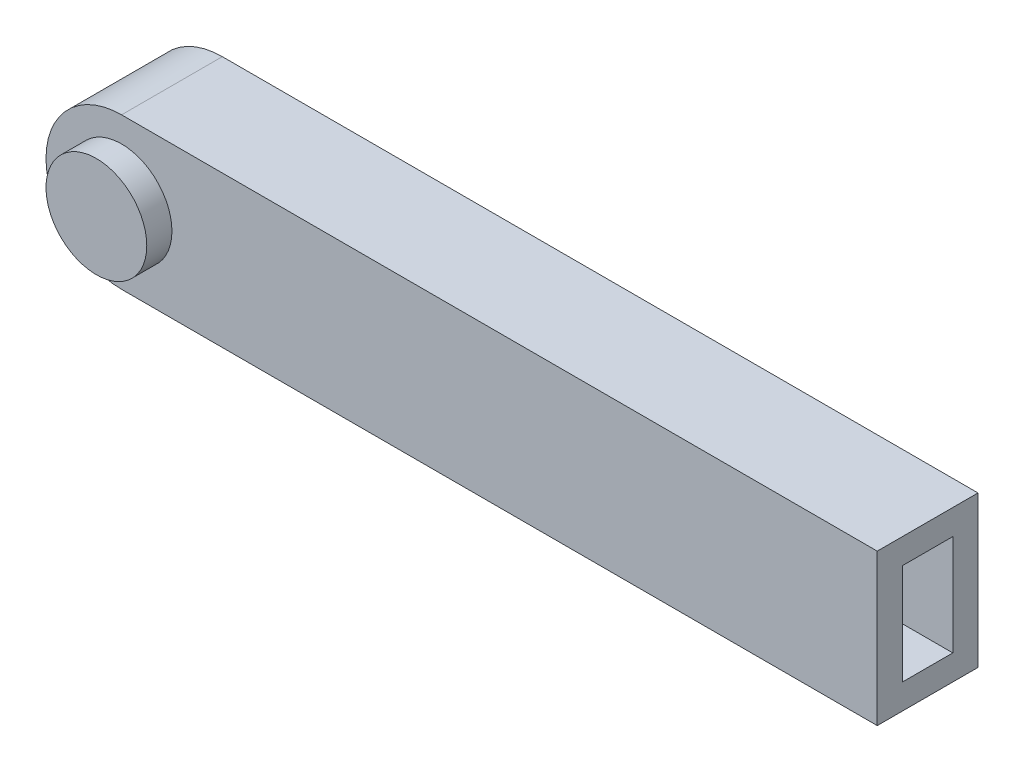
ISO-10303-21;
HEADER;
FILE_DESCRIPTION(('STEP AP214'),'2;1');
FILE_NAME('part.step','',(''),(''),'','','');
FILE_SCHEMA(('AUTOMOTIVE_DESIGN { 1 0 10303 214 1 1 1 1 }'));
ENDSEC;
DATA;
#1=APPLICATION_CONTEXT('core data for automotive mechanical design processes');
#2=APPLICATION_PROTOCOL_DEFINITION('international standard','automotive_design',2000,#1);
#3=PRODUCT_CONTEXT('',#1,'mechanical');
#4=PRODUCT('Part','Part','',(#3));
#5=PRODUCT_RELATED_PRODUCT_CATEGORY('part','',(#4));
#6=PRODUCT_DEFINITION_FORMATION('','',#4);
#7=PRODUCT_DEFINITION_CONTEXT('part definition',#1,'design');
#8=PRODUCT_DEFINITION('design','',#6,#7);
#9=PRODUCT_DEFINITION_SHAPE('','',#8);
#10=(LENGTH_UNIT() NAMED_UNIT(*) SI_UNIT(.MILLI.,.METRE.));
#11=(NAMED_UNIT(*) PLANE_ANGLE_UNIT() SI_UNIT($,.RADIAN.));
#12=(NAMED_UNIT(*) SI_UNIT($,.STERADIAN.) SOLID_ANGLE_UNIT());
#13=UNCERTAINTY_MEASURE_WITH_UNIT(LENGTH_MEASURE(1.E-05),#10,'distance_accuracy_value','');
#14=(GEOMETRIC_REPRESENTATION_CONTEXT(3) GLOBAL_UNCERTAINTY_ASSIGNED_CONTEXT((#13)) GLOBAL_UNIT_ASSIGNED_CONTEXT((#10,
#11,#12)) REPRESENTATION_CONTEXT('',''));
#15=CARTESIAN_POINT('',(0.,0.,0.));
#16=DIRECTION('',(0.,0.,1.));
#17=DIRECTION('',(1.,0.,0.));
#18=AXIS2_PLACEMENT_3D('',#15,#16,#17);
#19=CARTESIAN_POINT('',(0.,0.,-40.));
#20=DIRECTION('',(1.,0.,0.));
#21=DIRECTION('',(0.,1.,0.));
#22=AXIS2_PLACEMENT_3D('',#19,#20,#21);
#23=PLANE('',#22);
#24=DIRECTION('',(0.,1.,0.));
#25=VECTOR('',#24,1.);
#26=CARTESIAN_POINT('',(0.,0.,0.));
#27=LINE('',#26,#25);
#28=CARTESIAN_POINT('',(0.,0.,0.));
#29=VERTEX_POINT('',#28);
#30=CARTESIAN_POINT('',(0.,60.,0.));
#31=VERTEX_POINT('',#30);
#32=EDGE_CURVE('E160',#29,#31,#27,.T.);
#33=ORIENTED_EDGE('',*,*,#32,.F.);
#34=DIRECTION('',(0.,0.,1.));
#35=VECTOR('',#34,1.);
#36=CARTESIAN_POINT('',(0.,0.,-40.));
#37=LINE('',#36,#35);
#38=CARTESIAN_POINT('',(0.,0.,-40.));
#39=VERTEX_POINT('',#38);
#40=EDGE_CURVE('E177',#39,#29,#37,.T.);
#41=ORIENTED_EDGE('',*,*,#40,.F.);
#42=DIRECTION('',(0.,1.,0.));
#43=VECTOR('',#42,1.);
#44=CARTESIAN_POINT('',(0.,0.,-40.));
#45=LINE('',#44,#43);
#46=CARTESIAN_POINT('',(0.,60.,-40.));
#47=VERTEX_POINT('',#46);
#48=EDGE_CURVE('E164',#39,#47,#45,.T.);
#49=ORIENTED_EDGE('',*,*,#48,.T.);
#50=DIRECTION('',(0.,0.,1.));
#51=VECTOR('',#50,1.);
#52=CARTESIAN_POINT('',(0.,60.,-40.));
#53=LINE('',#52,#51);
#54=EDGE_CURVE('E45',#47,#31,#53,.T.);
#55=ORIENTED_EDGE('',*,*,#54,.T.);
#56=EDGE_LOOP('',(#33,#41,#49,#55));
#57=FACE_BOUND('',#56,.T.);
#58=DIRECTION('',(0.,0.,1.));
#59=VECTOR('',#58,1.);
#60=CARTESIAN_POINT('',(0.,10.,-40.));
#61=LINE('',#60,#59);
#62=CARTESIAN_POINT('',(0.,10.,-30.));
#63=VERTEX_POINT('',#62);
#64=CARTESIAN_POINT('',(0.,10.,-10.));
#65=VERTEX_POINT('',#64);
#66=EDGE_CURVE('E148',#63,#65,#61,.T.);
#67=ORIENTED_EDGE('',*,*,#66,.T.);
#68=DIRECTION('',(0.,1.,0.));
#69=VECTOR('',#68,1.);
#70=CARTESIAN_POINT('',(0.,0.,-10.));
#71=LINE('',#70,#69);
#72=CARTESIAN_POINT('',(0.,50.,-10.));
#73=VERTEX_POINT('',#72);
#74=EDGE_CURVE('E143',#65,#73,#71,.T.);
#75=ORIENTED_EDGE('',*,*,#74,.T.);
#76=DIRECTION('',(0.,0.,1.));
#77=VECTOR('',#76,1.);
#78=CARTESIAN_POINT('',(0.,50.,-40.));
#79=LINE('',#78,#77);
#80=CARTESIAN_POINT('',(0.,50.,-30.));
#81=VERTEX_POINT('',#80);
#82=EDGE_CURVE('E134',#81,#73,#79,.T.);
#83=ORIENTED_EDGE('',*,*,#82,.F.);
#84=DIRECTION('',(0.,1.,0.));
#85=VECTOR('',#84,1.);
#86=CARTESIAN_POINT('',(0.,0.,-30.));
#87=LINE('',#86,#85);
#88=EDGE_CURVE('E52',#63,#81,#87,.T.);
#89=ORIENTED_EDGE('',*,*,#88,.F.);
#90=EDGE_LOOP('',(#67,#75,#83,#89));
#91=FACE_BOUND('',#90,.T.);
#92=ADVANCED_FACE('F37',(#57,#91),#23,.T.);
#93=CARTESIAN_POINT('',(0.,60.,-40.));
#94=DIRECTION('',(0.,1.,0.));
#95=DIRECTION('',(-1.,0.,0.));
#96=AXIS2_PLACEMENT_3D('',#93,#94,#95);
#97=PLANE('',#96);
#98=DIRECTION('',(-1.,0.,0.));
#99=VECTOR('',#98,1.);
#100=CARTESIAN_POINT('',(0.,60.,0.));
#101=LINE('',#100,#99);
#102=CARTESIAN_POINT('',(-300.,60.,0.));
#103=VERTEX_POINT('',#102);
#104=EDGE_CURVE('E152',#31,#103,#101,.T.);
#105=ORIENTED_EDGE('',*,*,#104,.F.);
#106=ORIENTED_EDGE('',*,*,#54,.F.);
#107=DIRECTION('',(-1.,0.,0.));
#108=VECTOR('',#107,1.);
#109=CARTESIAN_POINT('',(0.,60.,-40.));
#110=LINE('',#109,#108);
#111=CARTESIAN_POINT('',(-300.,60.,-40.));
#112=VERTEX_POINT('',#111);
#113=EDGE_CURVE('E157',#47,#112,#110,.T.);
#114=ORIENTED_EDGE('',*,*,#113,.T.);
#115=DIRECTION('',(0.,0.,1.));
#116=VECTOR('',#115,1.);
#117=CARTESIAN_POINT('',(-300.,60.,-40.));
#118=LINE('',#117,#116);
#119=EDGE_CURVE('E86',#112,#103,#118,.T.);
#120=ORIENTED_EDGE('',*,*,#119,.T.);
#121=EDGE_LOOP('',(#105,#106,#114,#120));
#122=FACE_BOUND('',#121,.T.);
#123=ADVANCED_FACE('F39',(#122),#97,.T.);
#124=CARTESIAN_POINT('',(0.,0.,-40.));
#125=DIRECTION('',(0.,1.,0.));
#126=DIRECTION('',(0.,0.,1.));
#127=AXIS2_PLACEMENT_3D('',#124,#125,#126);
#128=PLANE('',#127);
#129=DIRECTION('',(-1.,0.,0.));
#130=VECTOR('',#129,1.);
#131=CARTESIAN_POINT('',(0.,0.,0.));
#132=LINE('',#131,#130);
#133=CARTESIAN_POINT('',(-300.,0.,0.));
#134=VERTEX_POINT('',#133);
#135=EDGE_CURVE('E171',#29,#134,#132,.T.);
#136=ORIENTED_EDGE('',*,*,#135,.T.);
#137=DIRECTION('',(0.,0.,1.));
#138=VECTOR('',#137,1.);
#139=CARTESIAN_POINT('',(-300.,0.,-40.));
#140=LINE('',#139,#138);
#141=CARTESIAN_POINT('',(-300.,0.,-40.));
#142=VERTEX_POINT('',#141);
#143=EDGE_CURVE('E179',#142,#134,#140,.T.);
#144=ORIENTED_EDGE('',*,*,#143,.F.);
#145=DIRECTION('',(-1.,0.,0.));
#146=VECTOR('',#145,1.);
#147=CARTESIAN_POINT('',(0.,0.,-40.));
#148=LINE('',#147,#146);
#149=EDGE_CURVE('E162',#39,#142,#148,.T.);
#150=ORIENTED_EDGE('',*,*,#149,.F.);
#151=ORIENTED_EDGE('',*,*,#40,.T.);
#152=EDGE_LOOP('',(#136,#144,#150,#151));
#153=FACE_BOUND('',#152,.T.);
#154=ADVANCED_FACE('F189',(#153),#128,.F.);
#155=CARTESIAN_POINT('',(-300.,30.,-40.));
#156=DIRECTION('',(0.,0.,1.));
#157=DIRECTION('',(1.,0.,0.));
#158=AXIS2_PLACEMENT_3D('',#155,#156,#157);
#159=CYLINDRICAL_SURFACE('',#158,30.);
#160=CARTESIAN_POINT('',(-300.,30.,0.));
#161=DIRECTION('',(0.,0.,1.));
#162=DIRECTION('',(1.,0.,0.));
#163=AXIS2_PLACEMENT_3D('',#160,#161,#162);
#164=CIRCLE('',#163,30.);
#165=EDGE_CURVE('E168',#103,#134,#164,.T.);
#166=ORIENTED_EDGE('',*,*,#165,.F.);
#167=ORIENTED_EDGE('',*,*,#119,.F.);
#168=CARTESIAN_POINT('',(-300.,30.,-40.));
#169=DIRECTION('',(0.,0.,1.));
#170=DIRECTION('',(1.,0.,0.));
#171=AXIS2_PLACEMENT_3D('',#168,#169,#170);
#172=CIRCLE('',#171,30.);
#173=EDGE_CURVE('E159',#112,#142,#172,.T.);
#174=ORIENTED_EDGE('',*,*,#173,.T.);
#175=ORIENTED_EDGE('',*,*,#143,.T.);
#176=EDGE_LOOP('',(#166,#167,#174,#175));
#177=FACE_BOUND('',#176,.T.);
#178=ADVANCED_FACE('F180',(#177),#159,.T.);
#179=CARTESIAN_POINT('',(0.,0.,-40.));
#180=DIRECTION('',(0.,0.,1.));
#181=DIRECTION('',(1.,0.,0.));
#182=AXIS2_PLACEMENT_3D('',#179,#180,#181);
#183=PLANE('',#182);
#184=CARTESIAN_POINT('',(-300.,30.,-40.));
#185=DIRECTION('',(0.,0.,1.));
#186=DIRECTION('',(1.,0.,0.));
#187=AXIS2_PLACEMENT_3D('',#184,#185,#186);
#188=CIRCLE('',#187,20.);
#189=CARTESIAN_POINT('',(-280.,30.,-40.));
#190=VERTEX_POINT('',#189);
#191=EDGE_CURVE('E11',#190,#190,#188,.F.);
#192=ORIENTED_EDGE('',*,*,#191,.F.);
#193=EDGE_LOOP('',(#192));
#194=FACE_BOUND('',#193,.T.);
#195=ORIENTED_EDGE('',*,*,#113,.F.);
#196=ORIENTED_EDGE('',*,*,#48,.F.);
#197=ORIENTED_EDGE('',*,*,#149,.T.);
#198=ORIENTED_EDGE('',*,*,#173,.F.);
#199=EDGE_LOOP('',(#195,#196,#197,#198));
#200=FACE_BOUND('',#199,.T.);
#201=ADVANCED_FACE('F191',(#194,#200),#183,.F.);
#202=CARTESIAN_POINT('',(0.,0.,0.));
#203=DIRECTION('',(0.,0.,1.));
#204=DIRECTION('',(1.,0.,0.));
#205=AXIS2_PLACEMENT_3D('',#202,#203,#204);
#206=PLANE('',#205);
#207=CARTESIAN_POINT('',(-300.,30.,0.));
#208=DIRECTION('',(0.,0.,1.));
#209=DIRECTION('',(1.,0.,0.));
#210=AXIS2_PLACEMENT_3D('',#207,#208,#209);
#211=CIRCLE('',#210,20.);
#212=CARTESIAN_POINT('',(-280.,30.,0.));
#213=VERTEX_POINT('',#212);
#214=EDGE_CURVE('E138',#213,#213,#211,.T.);
#215=ORIENTED_EDGE('',*,*,#214,.F.);
#216=EDGE_LOOP('',(#215));
#217=FACE_BOUND('',#216,.T.);
#218=ORIENTED_EDGE('',*,*,#104,.T.);
#219=ORIENTED_EDGE('',*,*,#165,.T.);
#220=ORIENTED_EDGE('',*,*,#135,.F.);
#221=ORIENTED_EDGE('',*,*,#32,.T.);
#222=EDGE_LOOP('',(#218,#219,#220,#221));
#223=FACE_BOUND('',#222,.T.);
#224=ADVANCED_FACE('F184',(#217,#223),#206,.T.);
#225=CARTESIAN_POINT('',(0.,50.,-40.));
#226=DIRECTION('',(0.,1.,0.));
#227=DIRECTION('',(-1.,0.,0.));
#228=AXIS2_PLACEMENT_3D('',#225,#226,#227);
#229=PLANE('',#228);
#230=DIRECTION('',(-1.,0.,0.));
#231=VECTOR('',#230,1.);
#232=CARTESIAN_POINT('',(0.,50.,-10.));
#233=LINE('',#232,#231);
#234=CARTESIAN_POINT('',(-300.,50.,-10.));
#235=VERTEX_POINT('',#234);
#236=EDGE_CURVE('E128',#73,#235,#233,.T.);
#237=ORIENTED_EDGE('',*,*,#236,.T.);
#238=DIRECTION('',(0.,0.,1.));
#239=VECTOR('',#238,1.);
#240=CARTESIAN_POINT('',(-300.,50.,-40.));
#241=LINE('',#240,#239);
#242=CARTESIAN_POINT('',(-300.,50.,-30.));
#243=VERTEX_POINT('',#242);
#244=EDGE_CURVE('E112',#243,#235,#241,.T.);
#245=ORIENTED_EDGE('',*,*,#244,.F.);
#246=DIRECTION('',(-1.,0.,0.));
#247=VECTOR('',#246,1.);
#248=CARTESIAN_POINT('',(0.,50.,-30.));
#249=LINE('',#248,#247);
#250=EDGE_CURVE('E142',#81,#243,#249,.T.);
#251=ORIENTED_EDGE('',*,*,#250,.F.);
#252=ORIENTED_EDGE('',*,*,#82,.T.);
#253=EDGE_LOOP('',(#237,#245,#251,#252));
#254=FACE_BOUND('',#253,.T.);
#255=ADVANCED_FACE('F132',(#254),#229,.F.);
#256=CARTESIAN_POINT('',(0.,10.,-40.));
#257=DIRECTION('',(0.,1.,0.));
#258=DIRECTION('',(0.,0.,1.));
#259=AXIS2_PLACEMENT_3D('',#256,#257,#258);
#260=PLANE('',#259);
#261=DIRECTION('',(-1.,0.,0.));
#262=VECTOR('',#261,1.);
#263=CARTESIAN_POINT('',(0.,10.,-10.));
#264=LINE('',#263,#262);
#265=CARTESIAN_POINT('',(-300.,10.,-10.));
#266=VERTEX_POINT('',#265);
#267=EDGE_CURVE('E130',#65,#266,#264,.T.);
#268=ORIENTED_EDGE('',*,*,#267,.F.);
#269=ORIENTED_EDGE('',*,*,#66,.F.);
#270=DIRECTION('',(-1.,0.,0.));
#271=VECTOR('',#270,1.);
#272=CARTESIAN_POINT('',(0.,10.,-30.));
#273=LINE('',#272,#271);
#274=CARTESIAN_POINT('',(-300.,10.,-30.));
#275=VERTEX_POINT('',#274);
#276=EDGE_CURVE('E146',#63,#275,#273,.T.);
#277=ORIENTED_EDGE('',*,*,#276,.T.);
#278=DIRECTION('',(0.,0.,1.));
#279=VECTOR('',#278,1.);
#280=CARTESIAN_POINT('',(-300.,10.,-40.));
#281=LINE('',#280,#279);
#282=EDGE_CURVE('E121',#275,#266,#281,.T.);
#283=ORIENTED_EDGE('',*,*,#282,.T.);
#284=EDGE_LOOP('',(#268,#269,#277,#283));
#285=FACE_BOUND('',#284,.T.);
#286=ADVANCED_FACE('F233',(#285),#260,.T.);
#287=CARTESIAN_POINT('',(-300.,30.,-40.));
#288=DIRECTION('',(0.,0.,1.));
#289=DIRECTION('',(1.,0.,0.));
#290=AXIS2_PLACEMENT_3D('',#287,#288,#289);
#291=CYLINDRICAL_SURFACE('',#290,20.);
#292=CARTESIAN_POINT('',(-300.,30.,-10.));
#293=DIRECTION('',(0.,0.,1.));
#294=DIRECTION('',(1.,0.,0.));
#295=AXIS2_PLACEMENT_3D('',#292,#293,#294);
#296=CIRCLE('',#295,20.);
#297=EDGE_CURVE('E116',#235,#266,#296,.T.);
#298=ORIENTED_EDGE('',*,*,#297,.T.);
#299=ORIENTED_EDGE('',*,*,#282,.F.);
#300=CARTESIAN_POINT('',(-300.,30.,-30.));
#301=DIRECTION('',(0.,0.,1.));
#302=DIRECTION('',(1.,0.,0.));
#303=AXIS2_PLACEMENT_3D('',#300,#301,#302);
#304=CIRCLE('',#303,20.);
#305=EDGE_CURVE('E118',#243,#275,#304,.T.);
#306=ORIENTED_EDGE('',*,*,#305,.F.);
#307=ORIENTED_EDGE('',*,*,#244,.T.);
#308=EDGE_LOOP('',(#298,#299,#306,#307));
#309=FACE_BOUND('',#308,.T.);
#310=ADVANCED_FACE('F114',(#309),#291,.F.);
#311=CARTESIAN_POINT('',(0.,0.,-30.));
#312=DIRECTION('',(0.,0.,1.));
#313=DIRECTION('',(1.,0.,0.));
#314=AXIS2_PLACEMENT_3D('',#311,#312,#313);
#315=PLANE('',#314);
#316=ORIENTED_EDGE('',*,*,#250,.T.);
#317=ORIENTED_EDGE('',*,*,#305,.T.);
#318=ORIENTED_EDGE('',*,*,#276,.F.);
#319=ORIENTED_EDGE('',*,*,#88,.T.);
#320=EDGE_LOOP('',(#316,#317,#318,#319));
#321=FACE_BOUND('',#320,.T.);
#322=ADVANCED_FACE('F251',(#321),#315,.T.);
#323=CARTESIAN_POINT('',(0.,0.,-10.));
#324=DIRECTION('',(0.,0.,1.));
#325=DIRECTION('',(1.,0.,0.));
#326=AXIS2_PLACEMENT_3D('',#323,#324,#325);
#327=PLANE('',#326);
#328=ORIENTED_EDGE('',*,*,#236,.F.);
#329=ORIENTED_EDGE('',*,*,#74,.F.);
#330=ORIENTED_EDGE('',*,*,#267,.T.);
#331=ORIENTED_EDGE('',*,*,#297,.F.);
#332=EDGE_LOOP('',(#328,#329,#330,#331));
#333=FACE_BOUND('',#332,.T.);
#334=ADVANCED_FACE('F126',(#333),#327,.F.);
#335=CARTESIAN_POINT('',(-300.,30.,10.));
#336=DIRECTION('',(0.,0.,-1.));
#337=DIRECTION('',(-1.,0.,0.));
#338=AXIS2_PLACEMENT_3D('',#335,#336,#337);
#339=CYLINDRICAL_SURFACE('',#338,20.);
#340=CARTESIAN_POINT('',(-300.,30.,10.));
#341=DIRECTION('',(0.,0.,1.));
#342=DIRECTION('',(1.,0.,0.));
#343=AXIS2_PLACEMENT_3D('',#340,#341,#342);
#344=CIRCLE('',#343,20.);
#345=CARTESIAN_POINT('',(-280.,30.,10.));
#346=VERTEX_POINT('',#345);
#347=EDGE_CURVE('E135',#346,#346,#344,.T.);
#348=ORIENTED_EDGE('',*,*,#347,.F.);
#349=EDGE_LOOP('',(#348));
#350=FACE_BOUND('',#349,.T.);
#351=ORIENTED_EDGE('',*,*,#214,.T.);
#352=EDGE_LOOP('',(#351));
#353=FACE_BOUND('',#352,.T.);
#354=ADVANCED_FACE('F268',(#350,#353),#339,.T.);
#355=CARTESIAN_POINT('',(0.,0.,10.));
#356=DIRECTION('',(0.,0.,1.));
#357=DIRECTION('',(1.,0.,0.));
#358=AXIS2_PLACEMENT_3D('',#355,#356,#357);
#359=PLANE('',#358);
#360=ORIENTED_EDGE('',*,*,#347,.T.);
#361=EDGE_LOOP('',(#360));
#362=FACE_BOUND('',#361,.T.);
#363=ADVANCED_FACE('F281',(#362),#359,.T.);
#364=CARTESIAN_POINT('',(-300.,30.,-50.));
#365=DIRECTION('',(0.,0.,1.));
#366=DIRECTION('',(1.,0.,0.));
#367=AXIS2_PLACEMENT_3D('',#364,#365,#366);
#368=CYLINDRICAL_SURFACE('',#367,20.);
#369=CARTESIAN_POINT('',(-300.,30.,-50.));
#370=DIRECTION('',(0.,0.,-1.));
#371=DIRECTION('',(-1.,0.,0.));
#372=AXIS2_PLACEMENT_3D('',#369,#370,#371);
#373=CIRCLE('',#372,20.);
#374=CARTESIAN_POINT('',(-320.,30.,-50.));
#375=VERTEX_POINT('',#374);
#376=EDGE_CURVE('E320',#375,#375,#373,.T.);
#377=ORIENTED_EDGE('',*,*,#376,.F.);
#378=EDGE_LOOP('',(#377));
#379=FACE_BOUND('',#378,.T.);
#380=ORIENTED_EDGE('',*,*,#191,.T.);
#381=EDGE_LOOP('',(#380));
#382=FACE_BOUND('',#381,.T.);
#383=ADVANCED_FACE('F290',(#379,#382),#368,.T.);
#384=CARTESIAN_POINT('',(-300.,30.,-50.));
#385=DIRECTION('',(0.,0.,-1.));
#386=DIRECTION('',(-1.,0.,0.));
#387=AXIS2_PLACEMENT_3D('',#384,#385,#386);
#388=PLANE('',#387);
#389=ORIENTED_EDGE('',*,*,#376,.T.);
#390=EDGE_LOOP('',(#389));
#391=FACE_BOUND('',#390,.T.);
#392=ADVANCED_FACE('F304',(#391),#388,.T.);
#393=CLOSED_SHELL('',(#92,#123,#154,#178,#201,#224,#255,#286,#310,#322,#334,#354,#363,#383,#392));
#394=MANIFOLD_SOLID_BREP('B2',#393);
#395=ADVANCED_BREP_SHAPE_REPRESENTATION('',(#18,#394),#14);
#396=SHAPE_DEFINITION_REPRESENTATION(#9,#395);
ENDSEC;
END-ISO-10303-21;
